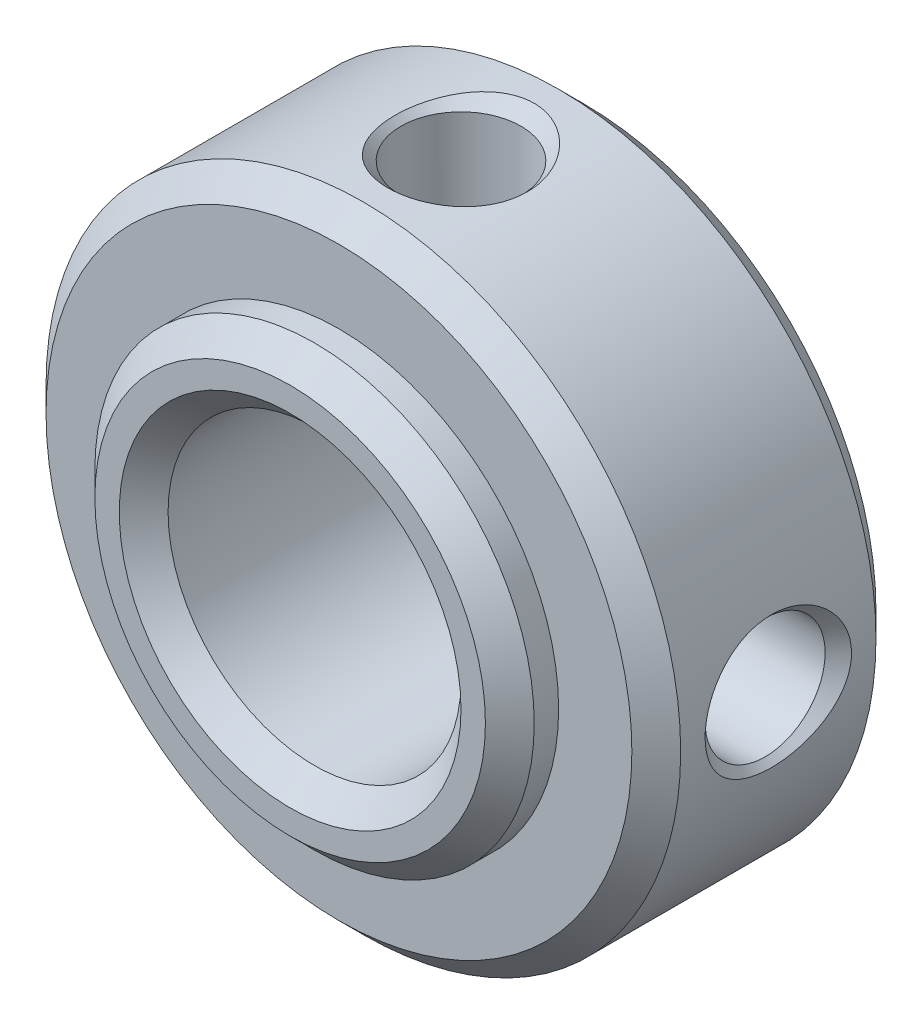
ISO-10303-21;
HEADER;
FILE_DESCRIPTION(('STEP AP214'),'2;1');
FILE_NAME('part.step','',(''),(''),'','','');
FILE_SCHEMA(('AUTOMOTIVE_DESIGN { 1 0 10303 214 1 1 1 1 }'));
ENDSEC;
DATA;
#1=APPLICATION_CONTEXT('core data for automotive mechanical design processes');
#2=APPLICATION_PROTOCOL_DEFINITION('international standard','automotive_design',2000,#1);
#3=PRODUCT_CONTEXT('',#1,'mechanical');
#4=PRODUCT('Part','Part','',(#3));
#5=PRODUCT_RELATED_PRODUCT_CATEGORY('part','',(#4));
#6=PRODUCT_DEFINITION_FORMATION('','',#4);
#7=PRODUCT_DEFINITION_CONTEXT('part definition',#1,'design');
#8=PRODUCT_DEFINITION('design','',#6,#7);
#9=PRODUCT_DEFINITION_SHAPE('','',#8);
#10=(LENGTH_UNIT() NAMED_UNIT(*) SI_UNIT(.MILLI.,.METRE.));
#11=(NAMED_UNIT(*) PLANE_ANGLE_UNIT() SI_UNIT($,.RADIAN.));
#12=(NAMED_UNIT(*) SI_UNIT($,.STERADIAN.) SOLID_ANGLE_UNIT());
#13=UNCERTAINTY_MEASURE_WITH_UNIT(LENGTH_MEASURE(1.E-05),#10,'distance_accuracy_value','');
#14=(GEOMETRIC_REPRESENTATION_CONTEXT(3) GLOBAL_UNCERTAINTY_ASSIGNED_CONTEXT((#13)) GLOBAL_UNIT_ASSIGNED_CONTEXT((#10,
#11,#12)) REPRESENTATION_CONTEXT('',''));
#15=CARTESIAN_POINT('',(0.,0.,0.));
#16=DIRECTION('',(0.,0.,1.));
#17=DIRECTION('',(1.,0.,0.));
#18=AXIS2_PLACEMENT_3D('',#15,#16,#17);
#19=CARTESIAN_POINT('',(0.,0.,-2.5));
#20=DIRECTION('',(0.,0.,-1.));
#21=DIRECTION('',(-1.,0.,0.));
#22=AXIS2_PLACEMENT_3D('',#19,#20,#21);
#23=CONICAL_SURFACE('',#22,3.5,0.785398163397448);
#24=CARTESIAN_POINT('',(0.,0.,-2.));
#25=DIRECTION('',(0.,0.,1.));
#26=DIRECTION('',(1.,0.,0.));
#27=AXIS2_PLACEMENT_3D('',#24,#25,#26);
#28=CIRCLE('',#27,3.);
#29=CARTESIAN_POINT('',(3.,0.,-2.));
#30=VERTEX_POINT('',#29);
#31=EDGE_CURVE('E45',#30,#30,#28,.T.);
#32=ORIENTED_EDGE('',*,*,#31,.T.);
#33=EDGE_LOOP('',(#32));
#34=FACE_BOUND('',#33,.T.);
#35=CARTESIAN_POINT('',(0.,0.,-2.5));
#36=DIRECTION('',(0.,0.,1.));
#37=DIRECTION('',(1.,0.,0.));
#38=AXIS2_PLACEMENT_3D('',#35,#36,#37);
#39=CIRCLE('',#38,3.5);
#40=CARTESIAN_POINT('',(3.5,0.,-2.5));
#41=VERTEX_POINT('',#40);
#42=EDGE_CURVE('E110',#41,#41,#39,.T.);
#43=ORIENTED_EDGE('',*,*,#42,.F.);
#44=EDGE_LOOP('',(#43));
#45=FACE_BOUND('',#44,.T.);
#46=ADVANCED_FACE('F30',(#34,#45),#23,.F.);
#47=CARTESIAN_POINT('',(0.,0.,3.5));
#48=DIRECTION('',(0.,0.,1.));
#49=DIRECTION('',(1.,0.,0.));
#50=AXIS2_PLACEMENT_3D('',#47,#48,#49);
#51=CYLINDRICAL_SURFACE('',#50,3.);
#52=CARTESIAN_POINT('',(-1.2295,2.73648127163334,0.));
#53=CARTESIAN_POINT('',(-1.22949315138636,2.73648780956102,-0.0656875868749673));
#54=CARTESIAN_POINT('',(-1.22420253559425,2.73888081381414,-0.131486805775669));
#55=CARTESIAN_POINT('',(-1.20324134105429,2.74815082242326,-0.261192876638242));
#56=CARTESIAN_POINT('',(-1.18754215883488,2.7550401822636,-0.325094005508318));
#57=CARTESIAN_POINT('',(-1.14647156088477,2.77238055395693,-0.448896329146983));
#58=CARTESIAN_POINT('',(-1.1211387013557,2.78281735069028,-0.508812364424551));
#59=CARTESIAN_POINT('',(-1.06163271912682,2.80605632232372,-0.623525890681637));
#60=CARTESIAN_POINT('',(-1.02746188831969,2.81885788373942,-0.678324703669666));
#61=CARTESIAN_POINT('',(-0.949051485785525,2.84624576616181,-0.784579281829049));
#62=CARTESIAN_POINT('',(-0.904364397367615,2.86089134904967,-0.835689693599048));
#63=CARTESIAN_POINT('',(-0.80713037140368,2.88982909756545,-0.929945222748565));
#64=CARTESIAN_POINT('',(-0.754580473886261,2.90412112772637,-0.973087326716475));
#65=CARTESIAN_POINT('',(-0.640419420006656,2.93145772839144,-1.05192232108959));
#66=CARTESIAN_POINT('',(-0.578521678763456,2.9444253707679,-1.08722930273783));
#67=CARTESIAN_POINT('',(-0.449038294588409,2.96692984694733,-1.14678088213323));
#68=CARTESIAN_POINT('',(-0.381455113683015,2.9764681564497,-1.17103023936959));
#69=CARTESIAN_POINT('',(-0.246142515052299,2.9906193808634,-1.20653477107205));
#70=CARTESIAN_POINT('',(-0.178593132993614,2.99545687164545,-1.2183847583595));
#71=CARTESIAN_POINT('',(-0.0423030743211912,3.00047548879171,-1.23067340121421));
#72=CARTESIAN_POINT('',(0.0264371250591212,3.00065843920655,-1.23111652697511));
#73=CARTESIAN_POINT('',(0.158843065489902,2.99648142293689,-1.22089652721338));
#74=CARTESIAN_POINT('',(0.222569172880482,2.99238846675702,-1.21088618733105));
#75=CARTESIAN_POINT('',(0.347344524354359,2.98048340348736,-1.18115883270878));
#76=CARTESIAN_POINT('',(0.408393571110869,2.97267102273945,-1.16144110374025));
#77=CARTESIAN_POINT('',(0.527194669373116,2.9539364025768,-1.11262060117527));
#78=CARTESIAN_POINT('',(0.584882515233401,2.94296870578276,-1.08337975342458));
#79=CARTESIAN_POINT('',(0.694682900248777,2.91900300610779,-1.01647580110389));
#80=CARTESIAN_POINT('',(0.746793482135163,2.90600429437943,-0.978809754054647));
#81=CARTESIAN_POINT('',(0.847751806093453,2.87823614609434,-0.893121195155266));
#82=CARTESIAN_POINT('',(0.896131508323045,2.86340640811089,-0.844565994266102));
#83=CARTESIAN_POINT('',(0.984259463325257,2.8343238240614,-0.739987821515472));
#84=CARTESIAN_POINT('',(1.02400459932354,2.82007118781416,-0.683962164819669));
#85=CARTESIAN_POINT('',(1.09488169836434,2.7933344144319,-0.563838371373095));
#86=CARTESIAN_POINT('',(1.12570941449411,2.78091856857543,-0.499544226049239));
#87=CARTESIAN_POINT('',(1.17591116152427,2.76006895426521,-0.366032884889098));
#88=CARTESIAN_POINT('',(1.19529307110252,2.7516324474554,-0.296819112313252));
#89=CARTESIAN_POINT('',(1.22088420198514,2.74036973715095,-0.16011527368096));
#90=CARTESIAN_POINT('',(1.22785010777662,2.7372219875884,-0.0927937670176184));
#91=CARTESIAN_POINT('',(1.23062760982761,2.73597518687805,0.0421152275604137));
#92=CARTESIAN_POINT('',(1.22644286097673,2.73787448144216,0.109702621073271));
#93=CARTESIAN_POINT('',(1.20772776335379,2.74617645512611,0.238881111371909));
#94=CARTESIAN_POINT('',(1.19384461620143,2.75229712124247,0.300586375733235));
#95=CARTESIAN_POINT('',(1.15697694064485,2.76799616906696,0.420745038277748));
#96=CARTESIAN_POINT('',(1.13399033047091,2.77757534161818,0.479197689167484));
#97=CARTESIAN_POINT('',(1.07850341271678,2.79959890680042,0.593909619533533));
#98=CARTESIAN_POINT('',(1.0456468007359,2.81214600076601,0.649976207023766));
#99=CARTESIAN_POINT('',(0.971711039083268,2.83854133304941,0.756063745800666));
#100=CARTESIAN_POINT('',(0.930628415410735,2.85239011978126,0.806082128452806));
#101=CARTESIAN_POINT('',(0.837614583671575,2.88113667186629,0.902725324616546));
#102=CARTESIAN_POINT('',(0.785085978357612,2.89603171091513,0.948778206319482));
#103=CARTESIAN_POINT('',(0.672696462266431,2.92418051506077,1.03151251873588));
#104=CARTESIAN_POINT('',(0.612835116684308,2.93743418273639,1.06819339332496));
#105=CARTESIAN_POINT('',(0.487147930636996,2.9608738194617,1.1310606384906));
#106=CARTESIAN_POINT('',(0.421314177733731,2.97105563929166,1.1572328303714));
#107=CARTESIAN_POINT('',(0.285655605562139,2.98714826285554,1.19794757318709));
#108=CARTESIAN_POINT('',(0.215833100375171,2.99306151638861,1.21249679524442));
#109=CARTESIAN_POINT('',(0.0793006171973759,2.99967730668242,1.22873243582459));
#110=CARTESIAN_POINT('',(0.0127017932051524,3.00070679242164,1.23122615829686));
#111=CARTESIAN_POINT('',(-0.119937680644487,2.99833483648245,1.2254344745692));
#112=CARTESIAN_POINT('',(-0.185978421006614,2.99493412768981,1.21715085126267));
#113=CARTESIAN_POINT('',(-0.31335350059418,2.98425243348016,1.19061851146278));
#114=CARTESIAN_POINT('',(-0.374771382452149,2.97710514384663,1.17271264038092));
#115=CARTESIAN_POINT('',(-0.493713482444953,2.95970663025144,1.12781230848352));
#116=CARTESIAN_POINT('',(-0.55123694627074,2.94945480706587,1.10081609297552));
#117=CARTESIAN_POINT('',(-0.663595981273958,2.92627386768644,1.03714322694257));
#118=CARTESIAN_POINT('',(-0.718195321073256,2.91324530347192,1.00008674047484));
#119=CARTESIAN_POINT('',(-0.820630636830925,2.88606626558856,0.917905875136611));
#120=CARTESIAN_POINT('',(-0.868464194428002,2.87191539356856,0.872778624437591));
#121=CARTESIAN_POINT('',(-0.959261150448482,2.84292750571023,0.772250057888369));
#122=CARTESIAN_POINT('',(-1.00170102773972,2.82810618568879,0.71636966936297));
#123=CARTESIAN_POINT('',(-1.07666900848907,2.8004263062305,0.597806494732244));
#124=CARTESIAN_POINT('',(-1.10919166926767,2.78756882649604,0.535119998856736));
#125=CARTESIAN_POINT('',(-1.16299317926956,2.76555425774474,0.405016823746895));
#126=CARTESIAN_POINT('',(-1.18435160089751,2.7563710936226,0.337637609923132));
#127=CARTESIAN_POINT('',(-1.21518173856349,2.74292337613586,0.199876050507217));
#128=CARTESIAN_POINT('',(-1.22469332912189,2.73864232698964,0.129504608027611));
#129=CARTESIAN_POINT('',(-1.22903121983948,2.73669093986595,0.0392921256605185));
#130=CARTESIAN_POINT('',(-1.22950204882705,2.7364793157509,0.0196510581590264));
#131=CARTESIAN_POINT('',(-1.2295,2.73648127163334,0.));
#132=B_SPLINE_CURVE_WITH_KNOTS('',3,(#52,#53,#54,#55,#56,#57,#58,#59,#60,#61,#62,#63,#64,#65,
#66,#67,#68,#69,#70,#71,#72,#73,#74,#75,#76,#77,#78,#79,#80,#81,#82,#83,#84,#85,#86,#87,#88,#89,
#90,#91,#92,#93,#94,#95,#96,#97,#98,#99,#100,#101,#102,#103,#104,#105,#106,#107,#108,#109,#110,
#111,#112,#113,#114,#115,#116,#117,#118,#119,#120,#121,#122,#123,#124,#125,#126,#127,#128,#129,
#130,#131),.UNSPECIFIED.,.T.,.F.,(4,2,2,2,2,2,2,2,2,2,2,2,2,2,2,2,2,2,2,2,2,2,2,2,2,2,2,2,2,2,2,
2,2,2,2,2,2,2,2,4),(0.,0.197007966215397,0.394559580690225,0.59132873008126,0.788046903701635,
0.995494474616982,1.20302033701821,1.41920485860491,1.63529624071189,1.84046581601936,
2.04555498694064,2.23856134929523,2.43158191436346,2.62753588803081,2.82355840527221,
3.03300883122902,3.24253473625559,3.45853784628883,3.67439209755867,3.87657241302121,
4.07868646727746,4.26846135135183,4.45827965801604,4.65600225587178,4.85380853252234,
5.06709525389457,5.28039462852352,5.49398083506076,5.70744436335559,5.90639415816305,
6.10531104494405,6.29756953893313,6.48986516551972,6.69078450728953,6.89177548516159,
7.10591887553853,7.32017957956198,7.53289158239508,7.74488567905245,7.80382246126762),.UNSPECIFIED.);
#133=CARTESIAN_POINT('',(-1.2295,2.73648127163334,0.));
#134=VERTEX_POINT('',#133);
#135=EDGE_CURVE('E33',#134,#134,#132,.T.);
#136=ORIENTED_EDGE('',*,*,#135,.F.);
#137=EDGE_LOOP('',(#136));
#138=FACE_BOUND('',#137,.T.);
#139=CARTESIAN_POINT('',(3.,0.,-1.2295));
#140=CARTESIAN_POINT('',(2.99999498511311,-0.0659514535856203,-1.22949328569729));
#141=CARTESIAN_POINT('',(2.99779986227982,-0.132011203774949,-1.22416188908903));
#142=CARTESIAN_POINT('',(2.98923181084605,-0.262262647630673,-1.20302356475284));
#143=CARTESIAN_POINT('',(2.98284778843995,-0.326448906785996,-1.18718881892747));
#144=CARTESIAN_POINT('',(2.9665887591172,-0.450857222468448,-1.1457227192484));
#145=CARTESIAN_POINT('',(2.9567254249085,-0.511091744949063,-1.12012409906108));
#146=CARTESIAN_POINT('',(2.93447272972049,-0.626354649209973,-1.0599898195502));
#147=CARTESIAN_POINT('',(2.92208418018727,-0.681384695087921,-1.02545703015189));
#148=CARTESIAN_POINT('',(2.89534823924166,-0.78745356945694,-0.946649320628341));
#149=CARTESIAN_POINT('',(2.88093806799954,-0.838204317616566,-0.902008137614048));
#150=CARTESIAN_POINT('',(2.85206114140614,-0.931744853904246,-0.805024648600714));
#151=CARTESIAN_POINT('',(2.83759436097932,-0.974530575298185,-0.752678432903756));
#152=CARTESIAN_POINT('',(2.80947961237513,-1.05292091176569,-0.638770960373231));
#153=CARTESIAN_POINT('',(2.79590260625976,-1.08809082515892,-0.57689120749616));
#154=CARTESIAN_POINT('',(2.77209579358365,-1.14739431537322,-0.44745599561159));
#155=CARTESIAN_POINT('',(2.76186431901926,-1.17153339430377,-0.379903386137431));
#156=CARTESIAN_POINT('',(2.74658421903306,-1.20691045759755,-0.244354056856373));
#157=CARTESIAN_POINT('',(2.7413144936938,-1.21870174053509,-0.176527606764895));
#158=CARTESIAN_POINT('',(2.73591659015033,-1.23077568317597,-0.039669887443424));
#159=CARTESIAN_POINT('',(2.73578570656521,-1.23106439849153,0.0293607286930878));
#160=CARTESIAN_POINT('',(2.74049253289023,-1.22054280844032,0.161238114360109));
#161=CARTESIAN_POINT('',(2.74496473839223,-1.21054899967416,0.224165656293475));
#162=CARTESIAN_POINT('',(2.7577579098135,-1.18111223614475,0.34735646373633));
#163=CARTESIAN_POINT('',(2.76607958506211,-1.16166753986357,0.407619235974188));
#164=CARTESIAN_POINT('',(2.78582002200623,-1.1135051701494,0.525264444025785));
#165=CARTESIAN_POINT('',(2.79729997649603,-1.08460188146217,0.582560163530171));
#166=CARTESIAN_POINT('',(2.82204815766591,-1.01847361536098,0.691706079150685));
#167=CARTESIAN_POINT('',(2.8353170753973,-0.98124541847393,0.743554157079704));
#168=CARTESIAN_POINT('',(2.86346450373987,-0.895960018736876,0.844780630016854));
#169=CARTESIAN_POINT('',(2.87838605601125,-0.847267490537693,0.893613265392653));
#170=CARTESIAN_POINT('',(2.90724204561816,-0.74223163459102,0.982599284268278));
#171=CARTESIAN_POINT('',(2.92117626596914,-0.685886632957271,1.02275076387559));
#172=CARTESIAN_POINT('',(2.94686865754846,-0.565532668884167,1.09399977352806));
#173=CARTESIAN_POINT('',(2.95857312748741,-0.5013840818608,1.12488223834395));
#174=CARTESIAN_POINT('',(2.97807769320191,-0.368200328119309,1.17522731577649));
#175=CARTESIAN_POINT('',(2.98587987416027,-0.299167793691065,1.19469602827581));
#176=CARTESIAN_POINT('',(2.99631517713848,-0.162742348037352,1.22053466920447));
#177=CARTESIAN_POINT('',(2.99923703991062,-0.0955102741162199,1.22763743605326));
#178=CARTESIAN_POINT('',(3.00049911766206,0.0392426816075556,1.23071871383928));
#179=CARTESIAN_POINT('',(2.99884059424314,0.106763478770607,1.22670028794911));
#180=CARTESIAN_POINT('',(2.99131629784099,0.23679122112461,1.20818391479628));
#181=CARTESIAN_POINT('',(2.98565483728674,0.299383745656251,1.19419461800537));
#182=CARTESIAN_POINT('',(2.97090953103081,0.421269379771581,1.15683495928111));
#183=CARTESIAN_POINT('',(2.96182524970108,0.480562068276791,1.13346340322734));
#184=CARTESIAN_POINT('',(2.94076075800053,0.596230291018692,1.07723854936493));
#185=CARTESIAN_POINT('',(2.92869973207055,0.652459057517629,1.04411456352327));
#186=CARTESIAN_POINT('',(2.9029776109099,0.758760050709084,0.969623659663462));
#187=CARTESIAN_POINT('',(2.88931585881557,0.808829732601657,0.928253352820842));
#188=CARTESIAN_POINT('',(2.86070072959535,0.905031595838981,0.835090141940414));
#189=CARTESIAN_POINT('',(2.84572340909333,0.950651248882355,0.782773977429631));
#190=CARTESIAN_POINT('',(2.81702464968191,1.03259972531423,0.670978605902497));
#191=CARTESIAN_POINT('',(2.80330346266884,1.06892668781994,0.611497967685884));
#192=CARTESIAN_POINT('',(2.77861081388899,1.13158082456849,0.485975649204291));
#193=CARTESIAN_POINT('',(2.76767521401346,1.15777963115296,0.419862325755617));
#194=CARTESIAN_POINT('',(2.75030847354089,1.19845804973928,0.28357566350282));
#195=CARTESIAN_POINT('',(2.74387378192563,1.21294690178531,0.213405572741347));
#196=CARTESIAN_POINT('',(2.73676775095077,1.22889032551675,0.0766639520735848));
#197=CARTESIAN_POINT('',(2.73570062793635,1.23124035133271,0.0102168435405049));
#198=CARTESIAN_POINT('',(2.73840503500129,1.2252138393541,-0.122081983635419));
#199=CARTESIAN_POINT('',(2.74217587828009,1.21683882409304,-0.187933785452013));
#200=CARTESIAN_POINT('',(2.75377473340919,1.19034373537945,-0.314222547223238));
#201=CARTESIAN_POINT('',(2.76141877653731,1.17266424718384,-0.374770419484951));
#202=CARTESIAN_POINT('',(2.77976449429752,1.12848502186667,-0.492058884919983));
#203=CARTESIAN_POINT('',(2.79046702208636,1.10198282333109,-0.548798410303214));
#204=CARTESIAN_POINT('',(2.81450713105456,1.0391075640444,-0.660509866738834));
#205=CARTESIAN_POINT('',(2.82796290964367,1.00224445147623,-0.715180093422894));
#206=CARTESIAN_POINT('',(2.85565105030456,0.920392371525508,-0.817839361321364));
#207=CARTESIAN_POINT('',(2.86988366626076,0.875400736363273,-0.865826199865001));
#208=CARTESIAN_POINT('',(2.89871006864603,0.774853209283579,-0.957183252100704));
#209=CARTESIAN_POINT('',(2.91326023791293,0.718780498579464,-1.00000102144759));
#210=CARTESIAN_POINT('',(2.94008128893798,0.599700811693501,-1.0756405737496));
#211=CARTESIAN_POINT('',(2.95235112414249,0.536690672617394,-1.1084577713653));
#212=CARTESIAN_POINT('',(2.97303819539227,0.406581660855322,-1.1624274628876));
#213=CARTESIAN_POINT('',(2.98151900992786,0.339573482807291,-1.18377377969354));
#214=CARTESIAN_POINT('',(2.99393275040676,0.202622479051471,-1.21470588327966));
#215=CARTESIAN_POINT('',(2.99787999479812,0.132689619716405,-1.22432870245358));
#216=CARTESIAN_POINT('',(2.99978415049652,0.0417015292291352,-1.22897175289518));
#217=CARTESIAN_POINT('',(3.00000158588441,0.0208561797038031,-1.22950212329973));
#218=CARTESIAN_POINT('',(3.,0.,-1.2295));
#219=B_SPLINE_CURVE_WITH_KNOTS('',3,(#139,#140,#141,#142,#143,#144,#145,#146,#147,#148,#149,
#150,#151,#152,#153,#154,#155,#156,#157,#158,#159,#160,#161,#162,#163,#164,#165,#166,#167,#168,
#169,#170,#171,#172,#173,#174,#175,#176,#177,#178,#179,#180,#181,#182,#183,#184,#185,#186,#187,
#188,#189,#190,#191,#192,#193,#194,#195,#196,#197,#198,#199,#200,#201,#202,#203,#204,#205,#206,
#207,#208,#209,#210,#211,#212,#213,#214,#215,#216,#217,#218),.UNSPECIFIED.,.T.,.F.,(4,2,2,2,2,2,
2,2,2,2,2,2,2,2,2,2,2,2,2,2,2,2,2,2,2,2,2,2,2,2,2,2,2,2,2,2,2,2,2,4),(0.,0.197796476848555,
0.39611892017699,0.593782244182593,0.791382151420799,0.997808518364824,1.20433999386331,
1.42062773745645,1.63680748003642,1.84282127729825,2.04872661563105,2.23945548299843,
2.43021950936491,2.62497735172079,2.81981064299796,3.03052449908558,3.24128452074389,
3.45661193569793,3.67182416748392,3.87378277467297,4.07568576080444,4.26796477319144,
4.46026826551681,4.65851435705458,4.85684208638467,5.06889934237754,5.28099903014245,
5.49570509764268,5.71024157987188,5.90870001466506,6.10713027929823,6.29691314897361,
6.48674900987517,6.68778307817334,6.88888324607283,7.10395632066562,7.3191278600644,
7.53053919959828,7.74128098311942,7.80383121729397),.UNSPECIFIED.);
#220=CARTESIAN_POINT('',(3.,0.,-1.2295));
#221=VERTEX_POINT('',#220);
#222=EDGE_CURVE('E53',#221,#221,#219,.T.);
#223=ORIENTED_EDGE('',*,*,#222,.F.);
#224=EDGE_LOOP('',(#223));
#225=FACE_BOUND('',#224,.T.);
#226=CARTESIAN_POINT('',(0.,0.,3.));
#227=DIRECTION('',(0.,0.,1.));
#228=DIRECTION('',(1.,0.,0.));
#229=AXIS2_PLACEMENT_3D('',#226,#227,#228);
#230=CIRCLE('',#229,3.);
#231=CARTESIAN_POINT('',(3.,0.,3.));
#232=VERTEX_POINT('',#231);
#233=EDGE_CURVE('E83',#232,#232,#230,.T.);
#234=ORIENTED_EDGE('',*,*,#233,.T.);
#235=EDGE_LOOP('',(#234));
#236=FACE_BOUND('',#235,.T.);
#237=ORIENTED_EDGE('',*,*,#31,.F.);
#238=EDGE_LOOP('',(#237));
#239=FACE_BOUND('',#238,.T.);
#240=ADVANCED_FACE('F123',(#138,#225,#236,#239),#51,.F.);
#241=CARTESIAN_POINT('',(0.,0.,3.));
#242=DIRECTION('',(0.,0.,1.));
#243=DIRECTION('',(1.,0.,0.));
#244=AXIS2_PLACEMENT_3D('',#241,#242,#243);
#245=CONICAL_SURFACE('',#244,3.,0.785398163397448);
#246=CARTESIAN_POINT('',(0.,0.,3.5));
#247=DIRECTION('',(0.,0.,1.));
#248=DIRECTION('',(1.,0.,0.));
#249=AXIS2_PLACEMENT_3D('',#246,#247,#248);
#250=CIRCLE('',#249,3.5);
#251=CARTESIAN_POINT('',(3.5,0.,3.5));
#252=VERTEX_POINT('',#251);
#253=EDGE_CURVE('E86',#252,#252,#250,.T.);
#254=ORIENTED_EDGE('',*,*,#253,.T.);
#255=EDGE_LOOP('',(#254));
#256=FACE_BOUND('',#255,.T.);
#257=ORIENTED_EDGE('',*,*,#233,.F.);
#258=EDGE_LOOP('',(#257));
#259=FACE_BOUND('',#258,.T.);
#260=ADVANCED_FACE('F126',(#256,#259),#245,.F.);
#261=CARTESIAN_POINT('',(3.5,0.,3.5));
#262=DIRECTION('',(0.,0.,1.));
#263=DIRECTION('',(1.,0.,0.));
#264=AXIS2_PLACEMENT_3D('',#261,#262,#263);
#265=PLANE('',#264);
#266=CARTESIAN_POINT('',(0.,0.,3.5));
#267=DIRECTION('',(0.,0.,1.));
#268=DIRECTION('',(1.,0.,0.));
#269=AXIS2_PLACEMENT_3D('',#266,#267,#268);
#270=CIRCLE('',#269,4.);
#271=CARTESIAN_POINT('',(4.,0.,3.5));
#272=VERTEX_POINT('',#271);
#273=EDGE_CURVE('E89',#272,#272,#270,.T.);
#274=ORIENTED_EDGE('',*,*,#273,.T.);
#275=EDGE_LOOP('',(#274));
#276=FACE_BOUND('',#275,.T.);
#277=ORIENTED_EDGE('',*,*,#253,.F.);
#278=EDGE_LOOP('',(#277));
#279=FACE_BOUND('',#278,.T.);
#280=ADVANCED_FACE('F173',(#276,#279),#265,.T.);
#281=CARTESIAN_POINT('',(0.,0.,3.5));
#282=DIRECTION('',(0.,0.,-1.));
#283=DIRECTION('',(-1.,0.,0.));
#284=AXIS2_PLACEMENT_3D('',#281,#282,#283);
#285=CONICAL_SURFACE('',#284,4.,0.785398163397448);
#286=CARTESIAN_POINT('',(0.,0.,3.));
#287=DIRECTION('',(0.,0.,1.));
#288=DIRECTION('',(1.,0.,0.));
#289=AXIS2_PLACEMENT_3D('',#286,#287,#288);
#290=CIRCLE('',#289,4.5);
#291=CARTESIAN_POINT('',(4.5,0.,3.));
#292=VERTEX_POINT('',#291);
#293=EDGE_CURVE('E92',#292,#292,#290,.T.);
#294=ORIENTED_EDGE('',*,*,#293,.T.);
#295=EDGE_LOOP('',(#294));
#296=FACE_BOUND('',#295,.T.);
#297=ORIENTED_EDGE('',*,*,#273,.F.);
#298=EDGE_LOOP('',(#297));
#299=FACE_BOUND('',#298,.T.);
#300=ADVANCED_FACE('F167',(#296,#299),#285,.T.);
#301=CARTESIAN_POINT('',(0.,0.,3.5));
#302=DIRECTION('',(0.,0.,1.));
#303=DIRECTION('',(1.,0.,0.));
#304=AXIS2_PLACEMENT_3D('',#301,#302,#303);
#305=CYLINDRICAL_SURFACE('',#304,4.5);
#306=CARTESIAN_POINT('',(0.,0.,2.5));
#307=DIRECTION('',(0.,0.,1.));
#308=DIRECTION('',(1.,0.,0.));
#309=AXIS2_PLACEMENT_3D('',#306,#307,#308);
#310=CIRCLE('',#309,4.5);
#311=CARTESIAN_POINT('',(4.5,0.,2.5));
#312=VERTEX_POINT('',#311);
#313=EDGE_CURVE('E95',#312,#312,#310,.T.);
#314=ORIENTED_EDGE('',*,*,#313,.T.);
#315=EDGE_LOOP('',(#314));
#316=FACE_BOUND('',#315,.T.);
#317=ORIENTED_EDGE('',*,*,#293,.F.);
#318=EDGE_LOOP('',(#317));
#319=FACE_BOUND('',#318,.T.);
#320=ADVANCED_FACE('F161',(#316,#319),#305,.T.);
#321=CARTESIAN_POINT('',(4.5,0.,2.5));
#322=DIRECTION('',(0.,0.,1.));
#323=DIRECTION('',(1.,0.,0.));
#324=AXIS2_PLACEMENT_3D('',#321,#322,#323);
#325=PLANE('',#324);
#326=CARTESIAN_POINT('',(0.,0.,2.5));
#327=DIRECTION('',(0.,0.,1.));
#328=DIRECTION('',(1.,0.,0.));
#329=AXIS2_PLACEMENT_3D('',#326,#327,#328);
#330=CIRCLE('',#329,6.);
#331=CARTESIAN_POINT('',(6.,0.,2.5));
#332=VERTEX_POINT('',#331);
#333=EDGE_CURVE('E98',#332,#332,#330,.T.);
#334=ORIENTED_EDGE('',*,*,#333,.T.);
#335=EDGE_LOOP('',(#334));
#336=FACE_BOUND('',#335,.T.);
#337=ORIENTED_EDGE('',*,*,#313,.F.);
#338=EDGE_LOOP('',(#337));
#339=FACE_BOUND('',#338,.T.);
#340=ADVANCED_FACE('F156',(#336,#339),#325,.T.);
#341=CARTESIAN_POINT('',(0.,0.,2.5));
#342=DIRECTION('',(0.,0.,-1.));
#343=DIRECTION('',(-1.,0.,0.));
#344=AXIS2_PLACEMENT_3D('',#341,#342,#343);
#345=CONICAL_SURFACE('',#344,6.,0.785398163397448);
#346=CARTESIAN_POINT('',(0.,0.,2.));
#347=DIRECTION('',(0.,0.,1.));
#348=DIRECTION('',(1.,0.,0.));
#349=AXIS2_PLACEMENT_3D('',#346,#347,#348);
#350=CIRCLE('',#349,6.5);
#351=CARTESIAN_POINT('',(6.5,0.,2.));
#352=VERTEX_POINT('',#351);
#353=EDGE_CURVE('E101',#352,#352,#350,.T.);
#354=ORIENTED_EDGE('',*,*,#353,.T.);
#355=EDGE_LOOP('',(#354));
#356=FACE_BOUND('',#355,.T.);
#357=ORIENTED_EDGE('',*,*,#333,.F.);
#358=EDGE_LOOP('',(#357));
#359=FACE_BOUND('',#358,.T.);
#360=ADVANCED_FACE('F150',(#356,#359),#345,.T.);
#361=CARTESIAN_POINT('',(0.,0.,3.5));
#362=DIRECTION('',(0.,0.,1.));
#363=DIRECTION('',(1.,0.,0.));
#364=AXIS2_PLACEMENT_3D('',#361,#362,#363);
#365=CYLINDRICAL_SURFACE('',#364,6.5);
#366=CARTESIAN_POINT('',(-0.997556185502706,6.42299631902295,-1.01479069908117));
#367=CARTESIAN_POINT('',(-1.04234327530615,6.41604071061924,-0.961009031541656));
#368=CARTESIAN_POINT('',(-1.08328444677805,6.40920376441447,-0.903996408147598));
#369=CARTESIAN_POINT('',(-1.15699632123686,6.39630841133192,-0.78480217688573));
#370=CARTESIAN_POINT('',(-1.18976002020713,6.39025067398482,-0.722616198391815));
#371=CARTESIAN_POINT('',(-1.25296123734669,6.37819311295955,-0.580312588775395));
#372=CARTESIAN_POINT('',(-1.2813318932061,6.37249423994428,-0.499242673398974));
#373=CARTESIAN_POINT('',(-1.32492973799252,6.36357266922376,-0.333501253395416));
#374=CARTESIAN_POINT('',(-1.34015081992382,6.36035112212774,-0.248828094463968));
#375=CARTESIAN_POINT('',(-1.35757225860014,6.35665681218561,-0.0743373316447245));
#376=CARTESIAN_POINT('',(-1.35917446059137,6.35631034058012,0.0155433721859152));
#377=CARTESIAN_POINT('',(-1.34775351265749,6.35874140744853,0.194330262472242));
#378=CARTESIAN_POINT('',(-1.3347293591694,6.3615191602859,0.283236381635769));
#379=CARTESIAN_POINT('',(-1.29408338629536,6.36991216344521,0.45842484105523));
#380=CARTESIAN_POINT('',(-1.26632227873653,6.37555446583494,0.544673693476328));
#381=CARTESIAN_POINT('',(-1.19658509868312,6.38900926548345,0.711073046499909));
#382=CARTESIAN_POINT('',(-1.15460755434516,6.39682198743309,0.791222914615155));
#383=CARTESIAN_POINT('',(-1.05821109166006,6.41346430930817,0.941158740206396));
#384=CARTESIAN_POINT('',(-1.00407392463161,6.42226892273857,1.01112796244966));
#385=CARTESIAN_POINT('',(-0.883922022729588,6.43990318447769,1.14003462577334));
#386=CARTESIAN_POINT('',(-0.817912376607388,6.44873282047162,1.19897677125454));
#387=CARTESIAN_POINT('',(-0.680852714753399,6.46458324682751,1.29925354968155));
#388=CARTESIAN_POINT('',(-0.610528337642056,6.47168923781591,1.34156304679076));
#389=CARTESIAN_POINT('',(-0.463012794196869,6.48390837480895,1.41217381705269));
#390=CARTESIAN_POINT('',(-0.385828575877944,6.48902350963065,1.44048907778007));
#391=CARTESIAN_POINT('',(-0.236076723920464,6.49609525919059,1.47914249759118));
#392=CARTESIAN_POINT('',(-0.163945400477248,6.49833908423708,1.4911251514918));
#393=CARTESIAN_POINT('',(-0.0186776575684694,6.50037811513401,1.50202597511983));
#394=CARTESIAN_POINT('',(0.0544582800195327,6.50017445662283,1.50095020398621));
#395=CARTESIAN_POINT('',(0.194255422860283,6.49744706154135,1.48633972282277));
#396=CARTESIAN_POINT('',(0.261013347014021,6.49508556056463,1.47367613990338));
#397=CARTESIAN_POINT('',(0.391492121614492,6.4885285978483,1.43771357289071));
#398=CARTESIAN_POINT('',(0.455212810401812,6.48433303861001,1.41441402338571));
#399=CARTESIAN_POINT('',(0.579457109917456,6.47442694294798,1.35753854788629));
#400=CARTESIAN_POINT('',(0.639878855247076,6.46868495519591,1.32374675818609));
#401=CARTESIAN_POINT('',(0.754744558626788,6.45629185477967,1.24734539784732));
#402=CARTESIAN_POINT('',(0.80918657692191,6.44964044867204,1.20473297875215));
#403=CARTESIAN_POINT('',(0.915783654086335,6.43540901437801,1.10784689096352));
#404=CARTESIAN_POINT('',(0.967294742432075,6.42779922385839,1.05286981025892));
#405=CARTESIAN_POINT('',(1.06135939816729,6.41293916543013,0.935686696032396));
#406=CARTESIAN_POINT('',(1.1039091334459,6.40568905233801,0.873477587480998));
#407=CARTESIAN_POINT('',(1.18330423236935,6.39152436449024,0.736837366985789));
#408=CARTESIAN_POINT('',(1.21913849576804,6.38471775192858,0.661806449942205));
#409=CARTESIAN_POINT('',(1.27872195135448,6.37305216248351,0.506948481749891));
#410=CARTESIAN_POINT('',(1.30246736658264,6.36819379439723,0.427119940362144));
#411=CARTESIAN_POINT('',(1.33865440700725,6.36068981794489,0.259400015379559));
#412=CARTESIAN_POINT('',(1.35026559133949,6.35820765048101,0.171321085750143));
#413=CARTESIAN_POINT('',(1.35918515523276,6.35630675865072,-0.00559501580137059));
#414=CARTESIAN_POINT('',(1.35649131023598,6.35688851075062,-0.0944323035101275));
#415=CARTESIAN_POINT('',(1.33663770599394,6.36109309688626,-0.272287557688424));
#416=CARTESIAN_POINT('',(1.31917808710556,6.36477896192036,-0.361270814867983));
#417=CARTESIAN_POINT('',(1.26969407559444,6.3748340984817,-0.534954963852232));
#418=CARTESIAN_POINT('',(1.23766791694234,6.38120369537437,-0.619655335021115));
#419=CARTESIAN_POINT('',(1.15994715165711,6.39578508131355,-0.781454669391353));
#420=CARTESIAN_POINT('',(1.11437613979293,6.40398005150973,-0.858614322813817));
#421=CARTESIAN_POINT('',(1.01026292695147,6.42122594446992,-1.00356122131042));
#422=CARTESIAN_POINT('',(0.951722784729772,6.43027673124868,-1.07134995118026));
#423=CARTESIAN_POINT('',(0.826305887402803,6.44755797236237,-1.19151732138043));
#424=CARTESIAN_POINT('',(0.760032513933125,6.45580650803099,-1.24452063481007));
#425=CARTESIAN_POINT('',(0.618565954298341,6.47088936966888,-1.33714840858172));
#426=CARTESIAN_POINT('',(0.543380983730651,6.47772498249941,-1.37678506397015));
#427=CARTESIAN_POINT('',(0.394693904939345,6.48838788295447,-1.43709444614168));
#428=CARTESIAN_POINT('',(0.321837753409903,6.49245498141015,-1.45931665251491));
#429=CARTESIAN_POINT('',(0.173201174099851,6.49811607956058,-1.48999712294497));
#430=CARTESIAN_POINT('',(0.0974229426784945,6.49971190101752,-1.49846552617847));
#431=CARTESIAN_POINT('',(-0.0472579996089519,6.50019315176614,-1.50102825946936));
#432=CARTESIAN_POINT('',(-0.116140662823524,6.49931819590767,-1.4963932974289));
#433=CARTESIAN_POINT('',(-0.252094613890391,6.4954654799139,-1.4756652561615));
#434=CARTESIAN_POINT('',(-0.319165896415569,6.49248771359512,-1.45957214324091));
#435=CARTESIAN_POINT('',(-0.448964269724714,6.48479922753212,-1.41692121364792));
#436=CARTESIAN_POINT('',(-0.511729927455152,6.4801072452762,-1.39047633320748));
#437=CARTESIAN_POINT('',(-0.632267930127349,6.46945911437011,-1.32820176691389));
#438=CARTESIAN_POINT('',(-0.690041005165552,6.46350315100149,-1.29237345635734));
#439=CARTESIAN_POINT('',(-0.791667433234854,6.45178239233909,-1.21830820397979));
#440=CARTESIAN_POINT('',(-0.836328903316465,6.44611263128416,-1.18115318279378));
#441=CARTESIAN_POINT('',(-0.920724603409997,6.43460019739247,-1.1016673041817));
#442=CARTESIAN_POINT('',(-0.960459656101316,6.42875755362839,-1.05933731329279));
#443=CARTESIAN_POINT('',(-0.997556185502706,6.42299631902295,-1.01479069908117));
#444=B_SPLINE_CURVE_WITH_KNOTS('',3,(#366,#367,#368,#369,#370,#371,#372,#373,#374,#375,#376,
#377,#378,#379,#380,#381,#382,#383,#384,#385,#386,#387,#388,#389,#390,#391,#392,#393,#394,#395,
#396,#397,#398,#399,#400,#401,#402,#403,#404,#405,#406,#407,#408,#409,#410,#411,#412,#413,#414,
#415,#416,#417,#418,#419,#420,#421,#422,#423,#424,#425,#426,#427,#428,#429,#430,#431,#432,#433,
#434,#435,#436,#437,#438,#439,#440,#441,#442,#443),.UNSPECIFIED.,.T.,.F.,(4,2,2,2,2,2,2,2,2,2,2,
2,2,2,2,2,2,2,2,2,2,2,2,2,2,2,2,2,2,2,2,2,2,2,2,2,2,2,4),(0.,0.210848653156225,
0.421877283489778,0.678944354553335,0.936130750002794,1.20455765176565,1.47300297231784,
1.74403193321567,2.01508896262291,2.28041621014109,2.54563000362075,2.7913763023618,
3.03687647250791,3.25517001629792,3.47336227525965,3.67638957322767,3.87942766545527,
4.08695587538141,4.29455120749113,4.52078135443898,4.74710804781201,4.99630811967099,
5.24558600224077,5.51098670526393,5.77642868163801,6.04739433085033,6.31839284036501,
6.58699071656872,6.85554598531633,7.10992138927694,7.36406408242238,7.59163479191681,
7.81903766211278,8.02516476315896,8.23129247034152,8.43523136781905,8.63914039139591,
8.8138126342233,8.98845566853029),.UNSPECIFIED.);
#445=CARTESIAN_POINT('',(-0.997556185502706,6.42299631902295,-1.01479069908117));
#446=VERTEX_POINT('',#445);
#447=EDGE_CURVE('E10',#446,#446,#444,.T.);
#448=ORIENTED_EDGE('',*,*,#447,.F.);
#449=EDGE_LOOP('',(#448));
#450=FACE_BOUND('',#449,.T.);
#451=CARTESIAN_POINT('',(6.42299631902295,-0.997556185502706,-1.01479069908117));
#452=CARTESIAN_POINT('',(6.42996697572464,-0.952671055386489,-1.06869005673123));
#453=CARTESIAN_POINT('',(6.43705780721512,-0.903919534462934,-1.11934687699134));
#454=CARTESIAN_POINT('',(6.45087993600769,-0.799330514328036,-1.21284601378801));
#455=CARTESIAN_POINT('',(6.45761116433024,-0.743491662501444,-1.25568683482904));
#456=CARTESIAN_POINT('',(6.47090267287824,-0.617973222933436,-1.33712795188787));
#457=CARTESIAN_POINT('',(6.47732643098075,-0.54743821114769,-1.3744486387732));
#458=CARTESIAN_POINT('',(6.48806665116358,-0.400497574164808,-1.43535097768278));
#459=CARTESIAN_POINT('',(6.49238396911761,-0.324094347927998,-1.45893821054045));
#460=CARTESIAN_POINT('',(6.4980017992896,-0.175842160313596,-1.48937185887658));
#461=CARTESIAN_POINT('',(6.49955955122482,-0.104295523923362,-1.4976494057614));
#462=CARTESIAN_POINT('',(6.5002771344023,0.0391330052671574,-1.50147946623727));
#463=CARTESIAN_POINT('',(6.4994380184787,0.111014737027059,-1.49703756689574));
#464=CARTESIAN_POINT('',(6.49558431257049,0.248721294895206,-1.4763048700389));
#465=CARTESIAN_POINT('',(6.49269772288591,0.314656601378721,-1.46071081121599));
#466=CARTESIAN_POINT('',(6.48520106493617,0.44306567945564,-1.41917427952949));
#467=CARTESIAN_POINT('',(6.4805908078136,0.505539070875142,-1.39323067267403));
#468=CARTESIAN_POINT('',(6.4699265814271,0.627643987207568,-1.33100394190359));
#469=CARTESIAN_POINT('',(6.46382902716769,0.687107744795256,-1.29440056821636));
#470=CARTESIAN_POINT('',(6.45087119961644,0.799673361301591,-1.21258155326539));
#471=CARTESIAN_POINT('',(6.44401066102265,0.852772993893166,-1.16736291241229));
#472=CARTESIAN_POINT('',(6.42947609882687,0.95647042566058,-1.06503645333651));
#473=CARTESIAN_POINT('',(6.42178658219621,1.00635463194653,-1.00720813131394));
#474=CARTESIAN_POINT('',(6.40696951624363,1.09674236312275,-0.884575180347891));
#475=CARTESIAN_POINT('',(6.39984220567919,1.13724191653869,-0.819767614802225));
#476=CARTESIAN_POINT('',(6.38616324374205,1.21181714721174,-0.67816518462838));
#477=CARTESIAN_POINT('',(6.37973707387426,1.24486984160313,-0.600818205957894));
#478=CARTESIAN_POINT('',(6.36903699100139,1.29850583756569,-0.441774244046026));
#479=CARTESIAN_POINT('',(6.3647636973701,1.31908555105601,-0.360076016434192));
#480=CARTESIAN_POINT('',(6.35864477653535,1.34828736578371,-0.189559065548997));
#481=CARTESIAN_POINT('',(6.35695493838803,1.35614370681737,-0.10060268070345));
#482=CARTESIAN_POINT('',(6.35668678717651,1.35739901123562,0.0774222381836797));
#483=CARTESIAN_POINT('',(6.35810892419477,1.35079588335874,0.166490786585382));
#484=CARTESIAN_POINT('',(6.36394767415048,1.32301711451846,0.343723132959224));
#485=CARTESIAN_POINT('',(6.36841259959286,1.30160627844975,0.43184867323325));
#486=CARTESIAN_POINT('',(6.37985072460599,1.24432817064322,0.603124312142368));
#487=CARTESIAN_POINT('',(6.38682421159985,1.20845924228572,0.686273839367651));
#488=CARTESIAN_POINT('',(6.40231958566984,1.12345014974649,0.84392975819016));
#489=CARTESIAN_POINT('',(6.41081984906502,1.07449116733307,0.918535638547724));
#490=CARTESIAN_POINT('',(6.42836399291216,0.963978424754311,1.0577251270201));
#491=CARTESIAN_POINT('',(6.43740773590879,0.902427839832066,1.12231125462513));
#492=CARTESIAN_POINT('',(6.45428494585649,0.772169893051773,1.23515292250245));
#493=CARTESIAN_POINT('',(6.46215854102246,0.704121931295198,1.28416071706306));
#494=CARTESIAN_POINT('',(6.47624726966054,0.55986190407743,1.36849335017126));
#495=CARTESIAN_POINT('',(6.48246400487758,0.483657824071637,1.40383141875743));
#496=CARTESIAN_POINT('',(6.49178893411884,0.334164369100876,1.4557887773719));
#497=CARTESIAN_POINT('',(6.49516056459144,0.261450786114109,1.47401893120281));
#498=CARTESIAN_POINT('',(6.49942069227142,0.113859724789229,1.49695042835404));
#499=CARTESIAN_POINT('',(6.50031073931256,0.0389836265549831,1.5016602156603));
#500=CARTESIAN_POINT('',(6.49952845782505,-0.103939270320119,1.49748225844411));
#501=CARTESIAN_POINT('',(6.49806845600551,-0.172023229808047,1.48972134662201));
#502=CARTESIAN_POINT('',(6.49314398594222,-0.305888151988619,1.46306591021045));
#503=CARTESIAN_POINT('',(6.48967957099341,-0.371669175864234,1.44417168164222));
#504=CARTESIAN_POINT('',(6.48110790701733,-0.499348759573658,1.39605824254473));
#505=CARTESIAN_POINT('',(6.47599738303465,-0.561239283351492,1.36681843784083));
#506=CARTESIAN_POINT('',(6.46464257817004,-0.679662565603609,1.29917593283096));
#507=CARTESIAN_POINT('',(6.45839798663003,-0.736193849533121,1.2607707209134));
#508=CARTESIAN_POINT('',(6.44482129288209,-0.847141553781944,1.17269593568193));
#509=CARTESIAN_POINT('',(6.43744220842344,-0.90103342203423,1.1223739813928));
#510=CARTESIAN_POINT('',(6.42273002984851,-1.0005369834153,1.01412203547053));
#511=CARTESIAN_POINT('',(6.41539695666225,-1.04614513956621,0.956188812088179));
#512=CARTESIAN_POINT('',(6.40070784439356,-1.13272554669584,0.82791471837982));
#513=CARTESIAN_POINT('',(6.39342805136659,-1.17272876291984,0.756910232633554));
#514=CARTESIAN_POINT('',(6.38046849110903,-1.24130668099818,0.609448031923319));
#515=CARTESIAN_POINT('',(6.37478926878137,-1.26987749215762,0.532988470892302));
#516=CARTESIAN_POINT('',(6.36525316418495,-1.31688165569393,0.370640805088279));
#517=CARTESIAN_POINT('',(6.36156459489014,-1.33439564987675,0.284475410405398));
#518=CARTESIAN_POINT('',(6.35711097661951,-1.35545410670527,0.110372853538792));
#519=CARTESIAN_POINT('',(6.3563465881264,-1.35899541335527,0.0224352955861511));
#520=CARTESIAN_POINT('',(6.35785063003618,-1.35194339692785,-0.155415444028756));
#521=CARTESIAN_POINT('',(6.36020784032896,-1.34093632786309,-0.245311774818842));
#522=CARTESIAN_POINT('',(6.36783281367911,-1.30424440621466,-0.421939822484874));
#523=CARTESIAN_POINT('',(6.3731004265498,-1.27856031101316,-0.508671702411078));
#524=CARTESIAN_POINT('',(6.38534387480734,-1.21585529772702,-0.669023737621387));
#525=CARTESIAN_POINT('',(6.39212925816809,-1.18002692220068,-0.743126610212111));
#526=CARTESIAN_POINT('',(6.40688792600708,-1.09706752688625,-0.884552129464808));
#527=CARTESIAN_POINT('',(6.41486026402412,-1.04994549441334,-0.951880107294927));
#528=CARTESIAN_POINT('',(6.42299631902295,-0.997556185502706,-1.01479069908117));
#529=B_SPLINE_CURVE_WITH_KNOTS('',3,(#451,#452,#453,#454,#455,#456,#457,#458,#459,#460,#461,
#462,#463,#464,#465,#466,#467,#468,#469,#470,#471,#472,#473,#474,#475,#476,#477,#478,#479,#480,
#481,#482,#483,#484,#485,#486,#487,#488,#489,#490,#491,#492,#493,#494,#495,#496,#497,#498,#499,
#500,#501,#502,#503,#504,#505,#506,#507,#508,#509,#510,#511,#512,#513,#514,#515,#516,#517,#518,
#519,#520,#521,#522,#523,#524,#525,#526,#527,#528),.UNSPECIFIED.,.T.,.F.,(4,2,2,2,2,2,2,2,2,2,2,
2,2,2,2,2,2,2,2,2,2,2,2,2,2,2,2,2,2,2,2,2,2,2,2,2,2,2,4),(0.,0.211249479452781,
0.422539336607074,0.661356331085942,0.900076210174137,1.11506447073812,1.3299583113404,
1.53248287258369,1.73502963038207,1.94443221572551,2.15390784273036,2.38322859938149,
2.61264622535677,2.864618364483,3.11666295363742,3.3833786229987,3.65013286978256,
3.92122438878469,4.19234697850147,4.45989548589834,4.72737660817321,4.9786545326386,
5.22968864941411,5.45357893668716,5.67732936546118,5.88197233463566,6.08660986284993,
6.29165706119771,6.49676051361645,6.71815358667232,6.93964096900768,7.18406256200473,
7.42856726635821,7.69138164187977,7.95425537560077,8.22476827633792,8.49526721899224,
8.74203043919476,8.9885979373307),.UNSPECIFIED.);
#530=CARTESIAN_POINT('',(6.42299631902295,-0.997556185502706,-1.01479069908117));
#531=VERTEX_POINT('',#530);
#532=EDGE_CURVE('E41',#531,#531,#529,.T.);
#533=ORIENTED_EDGE('',*,*,#532,.F.);
#534=EDGE_LOOP('',(#533));
#535=FACE_BOUND('',#534,.T.);
#536=CARTESIAN_POINT('',(0.,0.,-2.));
#537=DIRECTION('',(0.,0.,1.));
#538=DIRECTION('',(1.,0.,0.));
#539=AXIS2_PLACEMENT_3D('',#536,#537,#538);
#540=CIRCLE('',#539,6.5);
#541=CARTESIAN_POINT('',(6.5,0.,-2.));
#542=VERTEX_POINT('',#541);
#543=EDGE_CURVE('E104',#542,#542,#540,.T.);
#544=ORIENTED_EDGE('',*,*,#543,.T.);
#545=EDGE_LOOP('',(#544));
#546=FACE_BOUND('',#545,.T.);
#547=ORIENTED_EDGE('',*,*,#353,.F.);
#548=EDGE_LOOP('',(#547));
#549=FACE_BOUND('',#548,.T.);
#550=ADVANCED_FACE('F58',(#450,#535,#546,#549),#365,.T.);
#551=CARTESIAN_POINT('',(0.,0.,-2.));
#552=DIRECTION('',(0.,0.,1.));
#553=DIRECTION('',(1.,0.,0.));
#554=AXIS2_PLACEMENT_3D('',#551,#552,#553);
#555=CONICAL_SURFACE('',#554,6.5,0.785398163397447);
#556=CARTESIAN_POINT('',(0.,0.,-2.5));
#557=DIRECTION('',(0.,0.,1.));
#558=DIRECTION('',(1.,0.,0.));
#559=AXIS2_PLACEMENT_3D('',#556,#557,#558);
#560=CIRCLE('',#559,6.);
#561=CARTESIAN_POINT('',(6.,0.,-2.5));
#562=VERTEX_POINT('',#561);
#563=EDGE_CURVE('E107',#562,#562,#560,.T.);
#564=ORIENTED_EDGE('',*,*,#563,.T.);
#565=EDGE_LOOP('',(#564));
#566=FACE_BOUND('',#565,.T.);
#567=ORIENTED_EDGE('',*,*,#543,.F.);
#568=EDGE_LOOP('',(#567));
#569=FACE_BOUND('',#568,.T.);
#570=ADVANCED_FACE('F141',(#566,#569),#555,.T.);
#571=CARTESIAN_POINT('',(6.,0.,-2.5));
#572=DIRECTION('',(0.,0.,-1.));
#573=DIRECTION('',(-1.,0.,0.));
#574=AXIS2_PLACEMENT_3D('',#571,#572,#573);
#575=PLANE('',#574);
#576=ORIENTED_EDGE('',*,*,#42,.T.);
#577=EDGE_LOOP('',(#576));
#578=FACE_BOUND('',#577,.T.);
#579=ORIENTED_EDGE('',*,*,#563,.F.);
#580=EDGE_LOOP('',(#579));
#581=FACE_BOUND('',#580,.T.);
#582=ADVANCED_FACE('F138',(#578,#581),#575,.T.);
#583=CARTESIAN_POINT('',(6.5,0.,0.));
#584=DIRECTION('',(1.,0.,0.));
#585=DIRECTION('',(0.,0.,-1.));
#586=AXIS2_PLACEMENT_3D('',#583,#584,#585);
#587=CYLINDRICAL_SURFACE('',#586,1.2295);
#588=ORIENTED_EDGE('',*,*,#222,.T.);
#589=EDGE_LOOP('',(#588));
#590=FACE_BOUND('',#589,.T.);
#591=CARTESIAN_POINT('',(6.2295,0.,0.));
#592=DIRECTION('',(1.,0.,0.));
#593=DIRECTION('',(0.,0.,-1.));
#594=AXIS2_PLACEMENT_3D('',#591,#592,#593);
#595=CIRCLE('',#594,1.2295);
#596=CARTESIAN_POINT('',(6.2295,0.,-1.2295));
#597=VERTEX_POINT('',#596);
#598=EDGE_CURVE('E113',#597,#597,#595,.T.);
#599=ORIENTED_EDGE('',*,*,#598,.T.);
#600=EDGE_LOOP('',(#599));
#601=FACE_BOUND('',#600,.T.);
#602=ADVANCED_FACE('F73',(#590,#601),#587,.F.);
#603=CARTESIAN_POINT('',(6.5,0.,0.));
#604=DIRECTION('',(1.,0.,0.));
#605=DIRECTION('',(0.,0.,-1.));
#606=AXIS2_PLACEMENT_3D('',#603,#604,#605);
#607=CONICAL_SURFACE('',#606,1.5,0.785398163397449);
#608=ORIENTED_EDGE('',*,*,#532,.T.);
#609=EDGE_LOOP('',(#608));
#610=FACE_BOUND('',#609,.T.);
#611=ORIENTED_EDGE('',*,*,#598,.F.);
#612=EDGE_LOOP('',(#611));
#613=FACE_BOUND('',#612,.T.);
#614=ADVANCED_FACE('F69',(#610,#613),#607,.F.);
#615=CARTESIAN_POINT('',(0.,6.5,0.));
#616=DIRECTION('',(0.,1.,0.));
#617=DIRECTION('',(-1.,0.,0.));
#618=AXIS2_PLACEMENT_3D('',#615,#616,#617);
#619=CYLINDRICAL_SURFACE('',#618,1.2295);
#620=ORIENTED_EDGE('',*,*,#135,.T.);
#621=EDGE_LOOP('',(#620));
#622=FACE_BOUND('',#621,.T.);
#623=CARTESIAN_POINT('',(0.,6.2295,0.));
#624=DIRECTION('',(0.,1.,0.));
#625=DIRECTION('',(-1.,0.,0.));
#626=AXIS2_PLACEMENT_3D('',#623,#624,#625);
#627=CIRCLE('',#626,1.2295);
#628=CARTESIAN_POINT('',(-1.2295,6.2295,0.));
#629=VERTEX_POINT('',#628);
#630=EDGE_CURVE('E116',#629,#629,#627,.T.);
#631=ORIENTED_EDGE('',*,*,#630,.T.);
#632=EDGE_LOOP('',(#631));
#633=FACE_BOUND('',#632,.T.);
#634=ADVANCED_FACE('F65',(#622,#633),#619,.F.);
#635=CARTESIAN_POINT('',(0.,6.5,0.));
#636=DIRECTION('',(0.,1.,0.));
#637=DIRECTION('',(-1.,0.,0.));
#638=AXIS2_PLACEMENT_3D('',#635,#636,#637);
#639=CONICAL_SURFACE('',#638,1.5,0.785398163397449);
#640=ORIENTED_EDGE('',*,*,#447,.T.);
#641=EDGE_LOOP('',(#640));
#642=FACE_BOUND('',#641,.T.);
#643=ORIENTED_EDGE('',*,*,#630,.F.);
#644=EDGE_LOOP('',(#643));
#645=FACE_BOUND('',#644,.T.);
#646=ADVANCED_FACE('F62',(#642,#645),#639,.F.);
#647=CLOSED_SHELL('',(#46,#240,#260,#280,#300,#320,#340,#360,#550,#570,#582,#602,#614,#634,#646));
#648=MANIFOLD_SOLID_BREP('B2',#647);
#649=ADVANCED_BREP_SHAPE_REPRESENTATION('',(#18,#648),#14);
#650=SHAPE_DEFINITION_REPRESENTATION(#9,#649);
ENDSEC;
END-ISO-10303-21;
